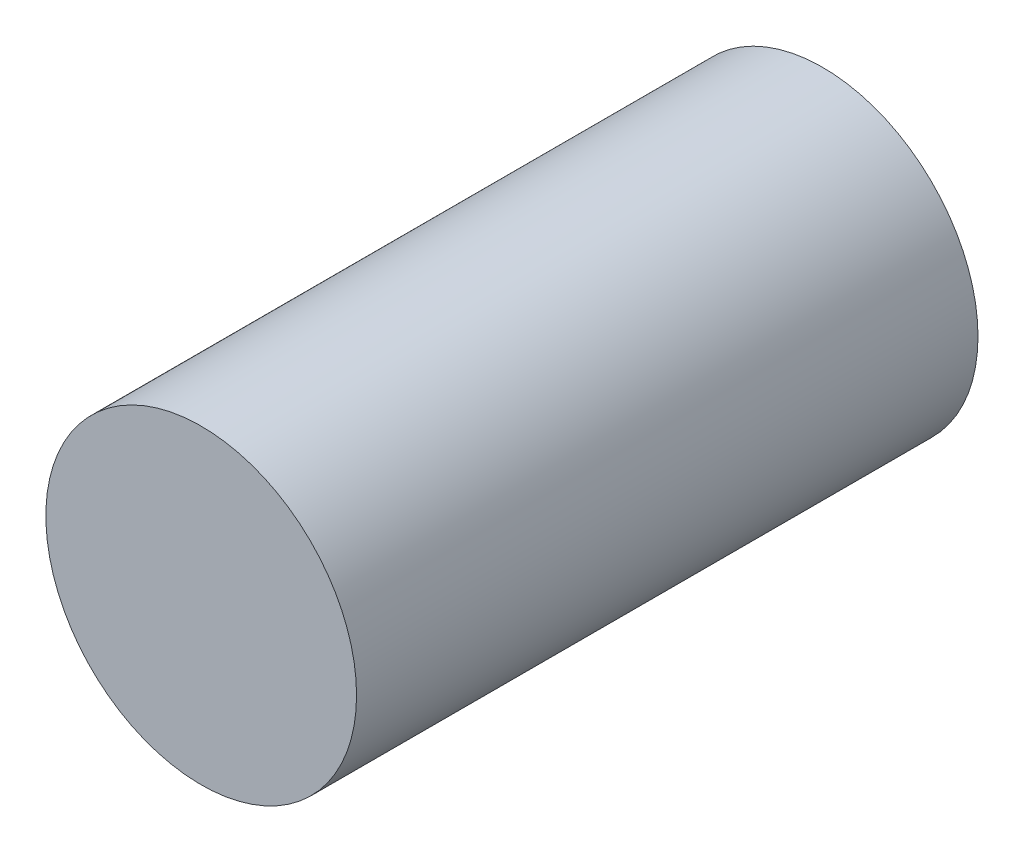
ISO-10303-21;
HEADER;
FILE_DESCRIPTION(('STEP AP214'),'2;1');
FILE_NAME('part.step','',(''),(''),'','','');
FILE_SCHEMA(('AUTOMOTIVE_DESIGN { 1 0 10303 214 1 1 1 1 }'));
ENDSEC;
DATA;
#1=APPLICATION_CONTEXT('core data for automotive mechanical design processes');
#2=APPLICATION_PROTOCOL_DEFINITION('international standard','automotive_design',2000,#1);
#3=PRODUCT_CONTEXT('',#1,'mechanical');
#4=PRODUCT('Part','Part','',(#3));
#5=PRODUCT_RELATED_PRODUCT_CATEGORY('part','',(#4));
#6=PRODUCT_DEFINITION_FORMATION('','',#4);
#7=PRODUCT_DEFINITION_CONTEXT('part definition',#1,'design');
#8=PRODUCT_DEFINITION('design','',#6,#7);
#9=PRODUCT_DEFINITION_SHAPE('','',#8);
#10=(LENGTH_UNIT() NAMED_UNIT(*) SI_UNIT(.MILLI.,.METRE.));
#11=(NAMED_UNIT(*) PLANE_ANGLE_UNIT() SI_UNIT($,.RADIAN.));
#12=(NAMED_UNIT(*) SI_UNIT($,.STERADIAN.) SOLID_ANGLE_UNIT());
#13=UNCERTAINTY_MEASURE_WITH_UNIT(LENGTH_MEASURE(1.E-05),#10,'distance_accuracy_value','');
#14=(GEOMETRIC_REPRESENTATION_CONTEXT(3) GLOBAL_UNCERTAINTY_ASSIGNED_CONTEXT((#13)) GLOBAL_UNIT_ASSIGNED_CONTEXT((#10,
#11,#12)) REPRESENTATION_CONTEXT('',''));
#15=CARTESIAN_POINT('',(0.,0.,0.));
#16=DIRECTION('',(0.,0.,1.));
#17=DIRECTION('',(1.,0.,0.));
#18=AXIS2_PLACEMENT_3D('',#15,#16,#17);
#19=CARTESIAN_POINT('',(0.,0.,6.));
#20=DIRECTION('',(0.,0.,-1.));
#21=DIRECTION('',(-1.,0.,0.));
#22=AXIS2_PLACEMENT_3D('',#19,#20,#21);
#23=CYLINDRICAL_SURFACE('',#22,1.5);
#24=CARTESIAN_POINT('',(0.,0.,6.));
#25=DIRECTION('',(0.,0.,1.));
#26=DIRECTION('',(1.,0.,0.));
#27=AXIS2_PLACEMENT_3D('',#24,#25,#26);
#28=CIRCLE('',#27,1.5);
#29=CARTESIAN_POINT('',(1.5,0.,6.));
#30=VERTEX_POINT('',#29);
#31=EDGE_CURVE('E10',#30,#30,#28,.T.);
#32=ORIENTED_EDGE('',*,*,#31,.F.);
#33=EDGE_LOOP('',(#32));
#34=FACE_BOUND('',#33,.T.);
#35=CARTESIAN_POINT('',(0.,0.,0.));
#36=DIRECTION('',(0.,0.,1.));
#37=DIRECTION('',(1.,0.,0.));
#38=AXIS2_PLACEMENT_3D('',#35,#36,#37);
#39=CIRCLE('',#38,1.5);
#40=CARTESIAN_POINT('',(1.5,0.,0.));
#41=VERTEX_POINT('',#40);
#42=EDGE_CURVE('E38',#41,#41,#39,.T.);
#43=ORIENTED_EDGE('',*,*,#42,.T.);
#44=EDGE_LOOP('',(#43));
#45=FACE_BOUND('',#44,.T.);
#46=ADVANCED_FACE('F35',(#34,#45),#23,.T.);
#47=CARTESIAN_POINT('',(0.,0.,6.));
#48=DIRECTION('',(0.,0.,1.));
#49=DIRECTION('',(1.,0.,0.));
#50=AXIS2_PLACEMENT_3D('',#47,#48,#49);
#51=PLANE('',#50);
#52=ORIENTED_EDGE('',*,*,#31,.T.);
#53=EDGE_LOOP('',(#52));
#54=FACE_BOUND('',#53,.T.);
#55=ADVANCED_FACE('F50',(#54),#51,.T.);
#56=CARTESIAN_POINT('',(0.,0.,0.));
#57=DIRECTION('',(0.,0.,1.));
#58=DIRECTION('',(1.,0.,0.));
#59=AXIS2_PLACEMENT_3D('',#56,#57,#58);
#60=PLANE('',#59);
#61=ORIENTED_EDGE('',*,*,#42,.F.);
#62=EDGE_LOOP('',(#61));
#63=FACE_BOUND('',#62,.T.);
#64=ADVANCED_FACE('F48',(#63),#60,.F.);
#65=CLOSED_SHELL('',(#46,#55,#64));
#66=MANIFOLD_SOLID_BREP('B2',#65);
#67=ADVANCED_BREP_SHAPE_REPRESENTATION('',(#18,#66),#14);
#68=SHAPE_DEFINITION_REPRESENTATION(#9,#67);
ENDSEC;
END-ISO-10303-21;
